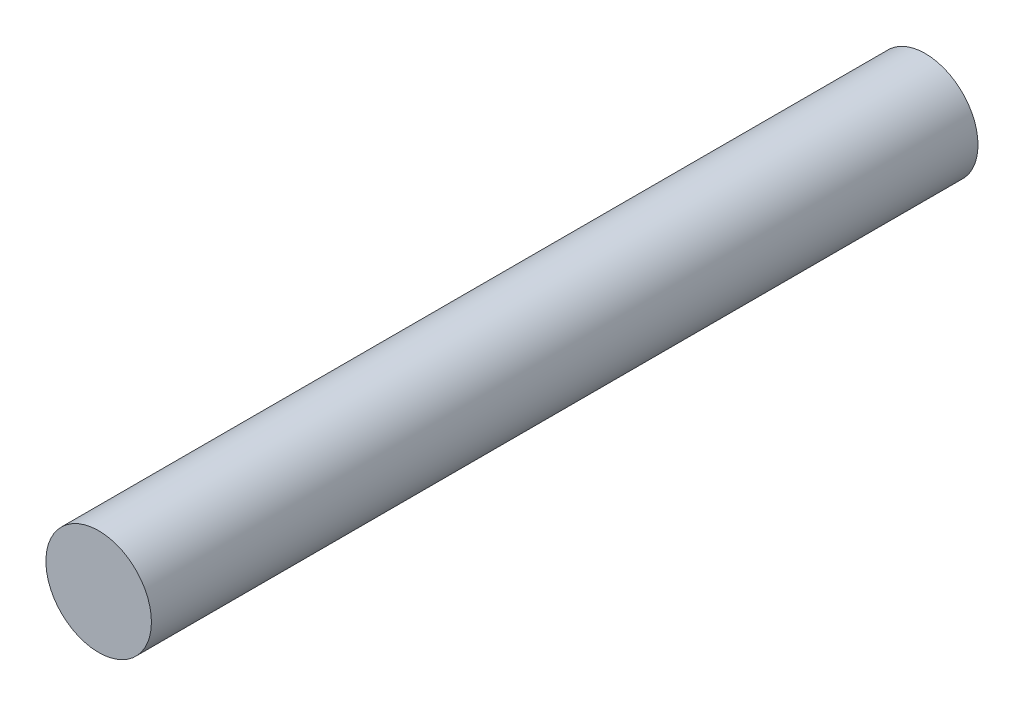
ISO-10303-21;
HEADER;
FILE_DESCRIPTION(('STEP AP214'),'2;1');
FILE_NAME('part.step','',(''),(''),'','','');
FILE_SCHEMA(('AUTOMOTIVE_DESIGN { 1 0 10303 214 1 1 1 1 }'));
ENDSEC;
DATA;
#1=APPLICATION_CONTEXT('core data for automotive mechanical design processes');
#2=APPLICATION_PROTOCOL_DEFINITION('international standard','automotive_design',2000,#1);
#3=PRODUCT_CONTEXT('',#1,'mechanical');
#4=PRODUCT('Part','Part','',(#3));
#5=PRODUCT_RELATED_PRODUCT_CATEGORY('part','',(#4));
#6=PRODUCT_DEFINITION_FORMATION('','',#4);
#7=PRODUCT_DEFINITION_CONTEXT('part definition',#1,'design');
#8=PRODUCT_DEFINITION('design','',#6,#7);
#9=PRODUCT_DEFINITION_SHAPE('','',#8);
#10=(LENGTH_UNIT() NAMED_UNIT(*) SI_UNIT(.MILLI.,.METRE.));
#11=(NAMED_UNIT(*) PLANE_ANGLE_UNIT() SI_UNIT($,.RADIAN.));
#12=(NAMED_UNIT(*) SI_UNIT($,.STERADIAN.) SOLID_ANGLE_UNIT());
#13=UNCERTAINTY_MEASURE_WITH_UNIT(LENGTH_MEASURE(1.E-05),#10,'distance_accuracy_value','');
#14=(GEOMETRIC_REPRESENTATION_CONTEXT(3) GLOBAL_UNCERTAINTY_ASSIGNED_CONTEXT((#13)) GLOBAL_UNIT_ASSIGNED_CONTEXT((#10,
#11,#12)) REPRESENTATION_CONTEXT('',''));
#15=CARTESIAN_POINT('',(0.,0.,0.));
#16=DIRECTION('',(0.,0.,1.));
#17=DIRECTION('',(1.,0.,0.));
#18=AXIS2_PLACEMENT_3D('',#15,#16,#17);
#19=CARTESIAN_POINT('',(0.,0.,0.));
#20=DIRECTION('',(0.,0.,1.));
#21=DIRECTION('',(1.,0.,0.));
#22=AXIS2_PLACEMENT_3D('',#19,#20,#21);
#23=CYLINDRICAL_SURFACE('',#22,1.5);
#24=CARTESIAN_POINT('',(0.,0.,19.5));
#25=DIRECTION('',(0.,0.,1.));
#26=DIRECTION('',(1.,0.,0.));
#27=AXIS2_PLACEMENT_3D('',#24,#25,#26);
#28=CIRCLE('',#27,1.5);
#29=CARTESIAN_POINT('',(1.5,0.,19.5));
#30=VERTEX_POINT('',#29);
#31=EDGE_CURVE('E10',#30,#30,#28,.T.);
#32=ORIENTED_EDGE('',*,*,#31,.F.);
#33=EDGE_LOOP('',(#32));
#34=FACE_BOUND('',#33,.T.);
#35=CARTESIAN_POINT('',(0.,0.,-4.));
#36=DIRECTION('',(0.,0.,-1.));
#37=DIRECTION('',(-1.,0.,0.));
#38=AXIS2_PLACEMENT_3D('',#35,#36,#37);
#39=CIRCLE('',#38,1.5);
#40=CARTESIAN_POINT('',(-1.5,0.,-4.));
#41=VERTEX_POINT('',#40);
#42=EDGE_CURVE('E38',#41,#41,#39,.T.);
#43=ORIENTED_EDGE('',*,*,#42,.F.);
#44=EDGE_LOOP('',(#43));
#45=FACE_BOUND('',#44,.T.);
#46=ADVANCED_FACE('F31',(#34,#45),#23,.T.);
#47=CARTESIAN_POINT('',(0.,0.,19.5));
#48=DIRECTION('',(0.,0.,1.));
#49=DIRECTION('',(1.,0.,0.));
#50=AXIS2_PLACEMENT_3D('',#47,#48,#49);
#51=PLANE('',#50);
#52=ORIENTED_EDGE('',*,*,#31,.T.);
#53=EDGE_LOOP('',(#52));
#54=FACE_BOUND('',#53,.T.);
#55=ADVANCED_FACE('F33',(#54),#51,.T.);
#56=CARTESIAN_POINT('',(0.,0.,-4.));
#57=DIRECTION('',(0.,0.,-1.));
#58=DIRECTION('',(-1.,0.,0.));
#59=AXIS2_PLACEMENT_3D('',#56,#57,#58);
#60=PLANE('',#59);
#61=ORIENTED_EDGE('',*,*,#42,.T.);
#62=EDGE_LOOP('',(#61));
#63=FACE_BOUND('',#62,.T.);
#64=ADVANCED_FACE('F44',(#63),#60,.T.);
#65=CLOSED_SHELL('',(#46,#55,#64));
#66=MANIFOLD_SOLID_BREP('B2',#65);
#67=ADVANCED_BREP_SHAPE_REPRESENTATION('',(#18,#66),#14);
#68=SHAPE_DEFINITION_REPRESENTATION(#9,#67);
ENDSEC;
END-ISO-10303-21;
